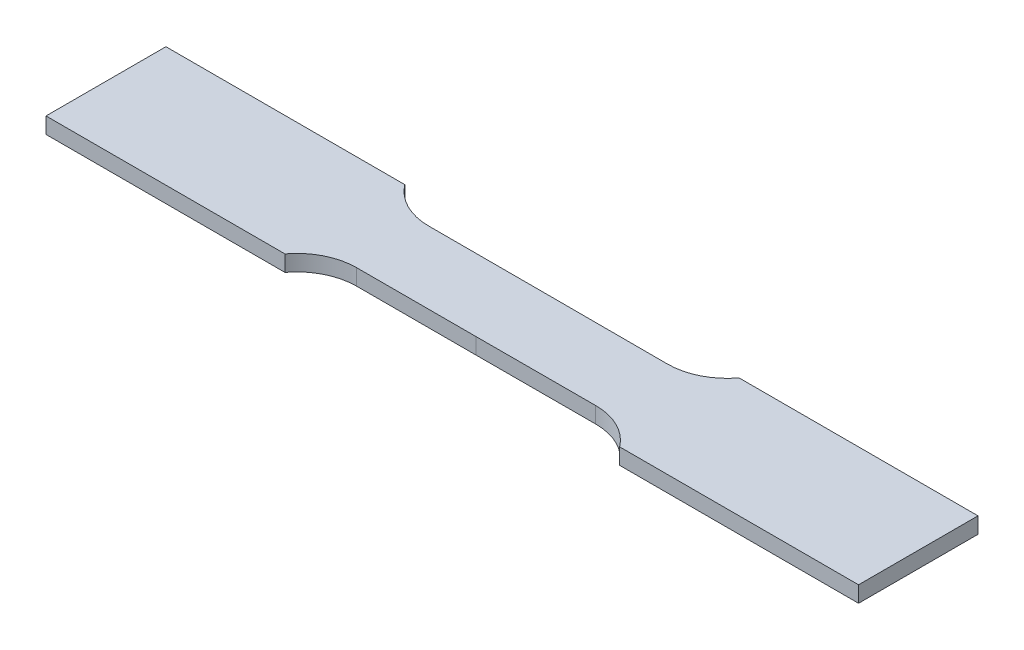
ISO-10303-21;
HEADER;
FILE_DESCRIPTION(('STEP AP214'),'2;1');
FILE_NAME('part.step','',(''),(''),'','','');
FILE_SCHEMA(('AUTOMOTIVE_DESIGN { 1 0 10303 214 1 1 1 1 }'));
ENDSEC;
DATA;
#1=APPLICATION_CONTEXT('core data for automotive mechanical design processes');
#2=APPLICATION_PROTOCOL_DEFINITION('international standard','automotive_design',2000,#1);
#3=PRODUCT_CONTEXT('',#1,'mechanical');
#4=PRODUCT('Part','Part','',(#3));
#5=PRODUCT_RELATED_PRODUCT_CATEGORY('part','',(#4));
#6=PRODUCT_DEFINITION_FORMATION('','',#4);
#7=PRODUCT_DEFINITION_CONTEXT('part definition',#1,'design');
#8=PRODUCT_DEFINITION('design','',#6,#7);
#9=PRODUCT_DEFINITION_SHAPE('','',#8);
#10=(LENGTH_UNIT() NAMED_UNIT(*) SI_UNIT(.MILLI.,.METRE.));
#11=(NAMED_UNIT(*) PLANE_ANGLE_UNIT() SI_UNIT($,.RADIAN.));
#12=(NAMED_UNIT(*) SI_UNIT($,.STERADIAN.) SOLID_ANGLE_UNIT());
#13=UNCERTAINTY_MEASURE_WITH_UNIT(LENGTH_MEASURE(1.E-05),#10,'distance_accuracy_value','');
#14=(GEOMETRIC_REPRESENTATION_CONTEXT(3) GLOBAL_UNCERTAINTY_ASSIGNED_CONTEXT((#13)) GLOBAL_UNIT_ASSIGNED_CONTEXT((#10,
#11,#12)) REPRESENTATION_CONTEXT('',''));
#15=CARTESIAN_POINT('',(0.,0.,0.));
#16=DIRECTION('',(0.,0.,1.));
#17=DIRECTION('',(1.,0.,0.));
#18=AXIS2_PLACEMENT_3D('',#15,#16,#17);
#19=CARTESIAN_POINT('',(0.,3.357,-12.4983559627253));
#20=DIRECTION('',(0.,0.,-1.));
#21=DIRECTION('',(-1.,0.,0.));
#22=AXIS2_PLACEMENT_3D('',#19,#20,#21);
#23=PLANE('',#22);
#24=DIRECTION('',(1.,0.,0.));
#25=VECTOR('',#24,1.);
#26=CARTESIAN_POINT('',(0.,0.,-12.4983559627253));
#27=LINE('',#26,#25);
#28=CARTESIAN_POINT('',(35.,0.,-12.4983559627253));
#29=VERTEX_POINT('',#28);
#30=CARTESIAN_POINT('',(85.,0.,-12.4983559627253));
#31=VERTEX_POINT('',#30);
#32=EDGE_CURVE('E167',#29,#31,#27,.T.);
#33=ORIENTED_EDGE('',*,*,#32,.F.);
#34=DIRECTION('',(0.,-1.,0.));
#35=VECTOR('',#34,1.);
#36=CARTESIAN_POINT('',(35.,3.357,-12.4983559627253));
#37=LINE('',#36,#35);
#38=CARTESIAN_POINT('',(35.,3.357,-12.4983559627253));
#39=VERTEX_POINT('',#38);
#40=EDGE_CURVE('E11',#39,#29,#37,.T.);
#41=ORIENTED_EDGE('',*,*,#40,.F.);
#42=DIRECTION('',(1.,0.,0.));
#43=VECTOR('',#42,1.);
#44=CARTESIAN_POINT('',(0.,3.357,-12.4983559627253));
#45=LINE('',#44,#43);
#46=CARTESIAN_POINT('',(85.,3.357,-12.4983559627253));
#47=VERTEX_POINT('',#46);
#48=EDGE_CURVE('E200',#39,#47,#45,.T.);
#49=ORIENTED_EDGE('',*,*,#48,.T.);
#50=DIRECTION('',(0.,-1.,0.));
#51=VECTOR('',#50,1.);
#52=CARTESIAN_POINT('',(85.,3.357,-12.4983559627253));
#53=LINE('',#52,#51);
#54=EDGE_CURVE('E52',#47,#31,#53,.T.);
#55=ORIENTED_EDGE('',*,*,#54,.T.);
#56=EDGE_LOOP('',(#33,#41,#49,#55));
#57=FACE_BOUND('',#56,.T.);
#58=ADVANCED_FACE('F36',(#57),#23,.T.);
#59=CARTESIAN_POINT('',(25.01249999375,3.357,-20.0149937500047));
#60=DIRECTION('',(0.,-1.,0.));
#61=DIRECTION('',(0.,0.,-1.));
#62=AXIS2_PLACEMENT_3D('',#59,#60,#61);
#63=CYLINDRICAL_SURFACE('',#62,12.5);
#64=CARTESIAN_POINT('',(25.01249999375,0.,-20.0149937500047));
#65=DIRECTION('',(0.,1.,0.));
#66=DIRECTION('',(0.,0.,1.));
#67=AXIS2_PLACEMENT_3D('',#64,#65,#66);
#68=CIRCLE('',#67,12.5);
#69=CARTESIAN_POINT('',(25.,0.,-7.51500000000001));
#70=VERTEX_POINT('',#69);
#71=EDGE_CURVE('E169',#29,#70,#68,.F.);
#72=ORIENTED_EDGE('',*,*,#71,.T.);
#73=DIRECTION('',(0.,-1.,0.));
#74=VECTOR('',#73,1.);
#75=CARTESIAN_POINT('',(25.,3.357,-7.51500000000001));
#76=LINE('',#75,#74);
#77=CARTESIAN_POINT('',(25.,3.357,-7.51500000000001));
#78=VERTEX_POINT('',#77);
#79=EDGE_CURVE('E44',#78,#70,#76,.T.);
#80=ORIENTED_EDGE('',*,*,#79,.F.);
#81=CARTESIAN_POINT('',(25.01249999375,3.357,-20.0149937500047));
#82=DIRECTION('',(0.,1.,0.));
#83=DIRECTION('',(0.,0.,1.));
#84=AXIS2_PLACEMENT_3D('',#81,#82,#83);
#85=CIRCLE('',#84,12.5);
#86=EDGE_CURVE('E249',#39,#78,#85,.F.);
#87=ORIENTED_EDGE('',*,*,#86,.F.);
#88=ORIENTED_EDGE('',*,*,#40,.T.);
#89=EDGE_LOOP('',(#72,#80,#87,#88));
#90=FACE_BOUND('',#89,.T.);
#91=ADVANCED_FACE('F282',(#90),#63,.F.);
#92=CARTESIAN_POINT('',(0.00753999246000593,3.357,-7.53999246000754));
#93=DIRECTION('',(-0.000999999500000161,0.,0.999999500000375));
#94=DIRECTION('',(0.999999500000375,0.,0.000999999500000161));
#95=AXIS2_PLACEMENT_3D('',#92,#93,#94);
#96=PLANE('',#95);
#97=DIRECTION('',(-0.999999500000375,0.,-0.000999999500000161));
#98=VECTOR('',#97,1.);
#99=CARTESIAN_POINT('',(0.00753999246000593,0.,-7.53999246000754));
#100=LINE('',#99,#98);
#101=CARTESIAN_POINT('',(0.,0.,-7.54));
#102=VERTEX_POINT('',#101);
#103=EDGE_CURVE('E171',#70,#102,#100,.T.);
#104=ORIENTED_EDGE('',*,*,#103,.T.);
#105=DIRECTION('',(0.,-1.,0.));
#106=VECTOR('',#105,1.);
#107=CARTESIAN_POINT('',(0.,3.357,-7.54));
#108=LINE('',#107,#106);
#109=CARTESIAN_POINT('',(0.,3.357,-7.54));
#110=VERTEX_POINT('',#109);
#111=EDGE_CURVE('E221',#110,#102,#108,.T.);
#112=ORIENTED_EDGE('',*,*,#111,.F.);
#113=DIRECTION('',(-0.999999500000375,0.,-0.000999999500000161));
#114=VECTOR('',#113,1.);
#115=CARTESIAN_POINT('',(0.00753999246000593,3.357,-7.53999246000754));
#116=LINE('',#115,#114);
#117=EDGE_CURVE('E230',#78,#110,#116,.T.);
#118=ORIENTED_EDGE('',*,*,#117,.F.);
#119=ORIENTED_EDGE('',*,*,#79,.T.);
#120=EDGE_LOOP('',(#104,#112,#118,#119));
#121=FACE_BOUND('',#120,.T.);
#122=ADVANCED_FACE('F228',(#121),#96,.F.);
#123=CARTESIAN_POINT('',(0.00150799993967863,3.357,-7.53999969840002));
#124=DIRECTION('',(-0.000199999995999818,0.,0.999999980000001));
#125=DIRECTION('',(0.999999980000001,0.,0.000199999995999818));
#126=AXIS2_PLACEMENT_3D('',#123,#124,#125);
#127=PLANE('',#126);
#128=DIRECTION('',(-0.999999980000001,0.,-0.000199999995999818));
#129=VECTOR('',#128,1.);
#130=CARTESIAN_POINT('',(0.00150799993967863,0.,-7.53999969840002));
#131=LINE('',#130,#129);
#132=CARTESIAN_POINT('',(-25.,0.,-7.545));
#133=VERTEX_POINT('',#132);
#134=EDGE_CURVE('E173',#102,#133,#131,.T.);
#135=ORIENTED_EDGE('',*,*,#134,.T.);
#136=DIRECTION('',(0.,-1.,0.));
#137=VECTOR('',#136,1.);
#138=CARTESIAN_POINT('',(-25.,3.357,-7.545));
#139=LINE('',#138,#137);
#140=CARTESIAN_POINT('',(-25.,3.357,-7.545));
#141=VERTEX_POINT('',#140);
#142=EDGE_CURVE('E219',#141,#133,#139,.T.);
#143=ORIENTED_EDGE('',*,*,#142,.F.);
#144=DIRECTION('',(-0.999999980000001,0.,-0.000199999995999818));
#145=VECTOR('',#144,1.);
#146=CARTESIAN_POINT('',(0.00150799993967863,3.357,-7.53999969840002));
#147=LINE('',#146,#145);
#148=EDGE_CURVE('E243',#110,#141,#147,.T.);
#149=ORIENTED_EDGE('',*,*,#148,.F.);
#150=ORIENTED_EDGE('',*,*,#111,.T.);
#151=EDGE_LOOP('',(#135,#143,#149,#150));
#152=FACE_BOUND('',#151,.T.);
#153=ADVANCED_FACE('F240',(#152),#127,.F.);
#154=CARTESIAN_POINT('',(-24.99750000005,3.357,-20.04499975));
#155=DIRECTION('',(0.,-1.,0.));
#156=DIRECTION('',(0.,0.,-1.));
#157=AXIS2_PLACEMENT_3D('',#154,#155,#156);
#158=CYLINDRICAL_SURFACE('',#157,12.5);
#159=CARTESIAN_POINT('',(-24.99750000005,0.,-20.04499975));
#160=DIRECTION('',(0.,1.,0.));
#161=DIRECTION('',(0.,0.,1.));
#162=AXIS2_PLACEMENT_3D('',#159,#160,#161);
#163=CIRCLE('',#162,12.5);
#164=CARTESIAN_POINT('',(-35.,0.,-12.5483342411888));
#165=VERTEX_POINT('',#164);
#166=EDGE_CURVE('E176',#165,#133,#163,.T.);
#167=ORIENTED_EDGE('',*,*,#166,.F.);
#168=DIRECTION('',(0.,-1.,0.));
#169=VECTOR('',#168,1.);
#170=CARTESIAN_POINT('',(-35.,3.357,-12.5483342411888));
#171=LINE('',#170,#169);
#172=CARTESIAN_POINT('',(-35.,3.357,-12.5483342411888));
#173=VERTEX_POINT('',#172);
#174=EDGE_CURVE('E217',#173,#165,#171,.T.);
#175=ORIENTED_EDGE('',*,*,#174,.F.);
#176=CARTESIAN_POINT('',(-24.99750000005,3.357,-20.04499975));
#177=DIRECTION('',(0.,1.,0.));
#178=DIRECTION('',(0.,0.,1.));
#179=AXIS2_PLACEMENT_3D('',#176,#177,#178);
#180=CIRCLE('',#179,12.5);
#181=EDGE_CURVE('E245',#173,#141,#180,.T.);
#182=ORIENTED_EDGE('',*,*,#181,.T.);
#183=ORIENTED_EDGE('',*,*,#142,.T.);
#184=EDGE_LOOP('',(#167,#175,#182,#183));
#185=FACE_BOUND('',#184,.T.);
#186=ADVANCED_FACE('F293',(#185),#158,.F.);
#187=CARTESIAN_POINT('',(0.,3.357,-12.5483342411888));
#188=DIRECTION('',(0.,0.,1.));
#189=DIRECTION('',(1.,0.,0.));
#190=AXIS2_PLACEMENT_3D('',#187,#188,#189);
#191=PLANE('',#190);
#192=DIRECTION('',(-1.,0.,0.));
#193=VECTOR('',#192,1.);
#194=CARTESIAN_POINT('',(0.,0.,-12.5483342411888));
#195=LINE('',#194,#193);
#196=CARTESIAN_POINT('',(-85.,0.,-12.5483342411887));
#197=VERTEX_POINT('',#196);
#198=EDGE_CURVE('E179',#165,#197,#195,.T.);
#199=ORIENTED_EDGE('',*,*,#198,.T.);
#200=DIRECTION('',(0.,-1.,0.));
#201=VECTOR('',#200,1.);
#202=CARTESIAN_POINT('',(-85.,3.357,-12.5483342411887));
#203=LINE('',#202,#201);
#204=CARTESIAN_POINT('',(-85.,3.357,-12.5483342411887));
#205=VERTEX_POINT('',#204);
#206=EDGE_CURVE('E214',#205,#197,#203,.T.);
#207=ORIENTED_EDGE('',*,*,#206,.F.);
#208=DIRECTION('',(-1.,0.,0.));
#209=VECTOR('',#208,1.);
#210=CARTESIAN_POINT('',(0.,3.357,-12.5483342411888));
#211=LINE('',#210,#209);
#212=EDGE_CURVE('E247',#173,#205,#211,.T.);
#213=ORIENTED_EDGE('',*,*,#212,.F.);
#214=ORIENTED_EDGE('',*,*,#174,.T.);
#215=EDGE_LOOP('',(#199,#207,#213,#214));
#216=FACE_BOUND('',#215,.T.);
#217=ADVANCED_FACE('F296',(#216),#191,.F.);
#218=CARTESIAN_POINT('',(-85.,3.357,0.));
#219=DIRECTION('',(1.,0.,0.));
#220=DIRECTION('',(0.,0.,-1.));
#221=AXIS2_PLACEMENT_3D('',#218,#219,#220);
#222=PLANE('',#221);
#223=DIRECTION('',(0.,0.,1.));
#224=VECTOR('',#223,1.);
#225=CARTESIAN_POINT('',(-85.,0.,0.));
#226=LINE('',#225,#224);
#227=CARTESIAN_POINT('',(-85.,0.,12.5483342411887));
#228=VERTEX_POINT('',#227);
#229=EDGE_CURVE('E181',#197,#228,#226,.T.);
#230=ORIENTED_EDGE('',*,*,#229,.T.);
#231=DIRECTION('',(0.,-1.,0.));
#232=VECTOR('',#231,1.);
#233=CARTESIAN_POINT('',(-85.,3.357,12.5483342411887));
#234=LINE('',#233,#232);
#235=CARTESIAN_POINT('',(-85.,3.357,12.5483342411887));
#236=VERTEX_POINT('',#235);
#237=EDGE_CURVE('E212',#236,#228,#234,.T.);
#238=ORIENTED_EDGE('',*,*,#237,.F.);
#239=DIRECTION('',(0.,0.,1.));
#240=VECTOR('',#239,1.);
#241=CARTESIAN_POINT('',(-85.,3.357,0.));
#242=LINE('',#241,#240);
#243=EDGE_CURVE('E254',#205,#236,#242,.T.);
#244=ORIENTED_EDGE('',*,*,#243,.F.);
#245=ORIENTED_EDGE('',*,*,#206,.T.);
#246=EDGE_LOOP('',(#230,#238,#244,#245));
#247=FACE_BOUND('',#246,.T.);
#248=ADVANCED_FACE('F300',(#247),#222,.F.);
#249=CARTESIAN_POINT('',(0.,3.357,12.5483342411888));
#250=DIRECTION('',(0.,0.,1.));
#251=DIRECTION('',(1.,0.,0.));
#252=AXIS2_PLACEMENT_3D('',#249,#250,#251);
#253=PLANE('',#252);
#254=DIRECTION('',(-1.,0.,0.));
#255=VECTOR('',#254,1.);
#256=CARTESIAN_POINT('',(0.,0.,12.5483342411888));
#257=LINE('',#256,#255);
#258=CARTESIAN_POINT('',(-35.,0.,12.5483342411888));
#259=VERTEX_POINT('',#258);
#260=EDGE_CURVE('E184',#259,#228,#257,.T.);
#261=ORIENTED_EDGE('',*,*,#260,.F.);
#262=DIRECTION('',(0.,-1.,0.));
#263=VECTOR('',#262,1.);
#264=CARTESIAN_POINT('',(-35.,3.357,12.5483342411888));
#265=LINE('',#264,#263);
#266=CARTESIAN_POINT('',(-35.,3.357,12.5483342411888));
#267=VERTEX_POINT('',#266);
#268=EDGE_CURVE('E210',#267,#259,#265,.T.);
#269=ORIENTED_EDGE('',*,*,#268,.F.);
#270=DIRECTION('',(-1.,0.,0.));
#271=VECTOR('',#270,1.);
#272=CARTESIAN_POINT('',(0.,3.357,12.5483342411888));
#273=LINE('',#272,#271);
#274=EDGE_CURVE('E256',#267,#236,#273,.T.);
#275=ORIENTED_EDGE('',*,*,#274,.T.);
#276=ORIENTED_EDGE('',*,*,#237,.T.);
#277=EDGE_LOOP('',(#261,#269,#275,#276));
#278=FACE_BOUND('',#277,.T.);
#279=ADVANCED_FACE('F304',(#278),#253,.T.);
#280=CARTESIAN_POINT('',(-24.99750000005,3.357,20.04499975));
#281=DIRECTION('',(0.,-1.,0.));
#282=DIRECTION('',(0.,0.,-1.));
#283=AXIS2_PLACEMENT_3D('',#280,#281,#282);
#284=CYLINDRICAL_SURFACE('',#283,12.5);
#285=CARTESIAN_POINT('',(-24.99750000005,0.,20.04499975));
#286=DIRECTION('',(0.,1.,0.));
#287=DIRECTION('',(0.,0.,1.));
#288=AXIS2_PLACEMENT_3D('',#285,#286,#287);
#289=CIRCLE('',#288,12.5);
#290=CARTESIAN_POINT('',(-25.,0.,7.545));
#291=VERTEX_POINT('',#290);
#292=EDGE_CURVE('E187',#259,#291,#289,.F.);
#293=ORIENTED_EDGE('',*,*,#292,.T.);
#294=DIRECTION('',(0.,-1.,0.));
#295=VECTOR('',#294,1.);
#296=CARTESIAN_POINT('',(-25.,3.357,7.545));
#297=LINE('',#296,#295);
#298=CARTESIAN_POINT('',(-25.,3.357,7.545));
#299=VERTEX_POINT('',#298);
#300=EDGE_CURVE('E207',#299,#291,#297,.T.);
#301=ORIENTED_EDGE('',*,*,#300,.F.);
#302=CARTESIAN_POINT('',(-24.99750000005,3.357,20.04499975));
#303=DIRECTION('',(0.,1.,0.));
#304=DIRECTION('',(0.,0.,1.));
#305=AXIS2_PLACEMENT_3D('',#302,#303,#304);
#306=CIRCLE('',#305,12.5);
#307=EDGE_CURVE('E259',#267,#299,#306,.F.);
#308=ORIENTED_EDGE('',*,*,#307,.F.);
#309=ORIENTED_EDGE('',*,*,#268,.T.);
#310=EDGE_LOOP('',(#293,#301,#308,#309));
#311=FACE_BOUND('',#310,.T.);
#312=ADVANCED_FACE('F308',(#311),#284,.F.);
#313=CARTESIAN_POINT('',(0.00150799993968125,3.357,7.53999969840001));
#314=DIRECTION('',(-0.000199999996000165,0.,-0.999999980000001));
#315=DIRECTION('',(-0.999999980000001,0.,0.000199999996000165));
#316=AXIS2_PLACEMENT_3D('',#313,#314,#315);
#317=PLANE('',#316);
#318=DIRECTION('',(0.999999980000001,0.,-0.000199999996000165));
#319=VECTOR('',#318,1.);
#320=CARTESIAN_POINT('',(0.00150799993968125,0.,7.53999969840001));
#321=LINE('',#320,#319);
#322=CARTESIAN_POINT('',(0.,0.,7.53999999999999));
#323=VERTEX_POINT('',#322);
#324=EDGE_CURVE('E189',#291,#323,#321,.T.);
#325=ORIENTED_EDGE('',*,*,#324,.T.);
#326=DIRECTION('',(0.,-1.,0.));
#327=VECTOR('',#326,1.);
#328=CARTESIAN_POINT('',(0.,3.357,7.53999999999999));
#329=LINE('',#328,#327);
#330=CARTESIAN_POINT('',(0.,3.357,7.53999999999999));
#331=VERTEX_POINT('',#330);
#332=EDGE_CURVE('E204',#331,#323,#329,.T.);
#333=ORIENTED_EDGE('',*,*,#332,.F.);
#334=DIRECTION('',(0.999999980000001,0.,-0.000199999996000165));
#335=VECTOR('',#334,1.);
#336=CARTESIAN_POINT('',(0.00150799993968125,3.357,7.53999969840001));
#337=LINE('',#336,#335);
#338=EDGE_CURVE('E162',#299,#331,#337,.T.);
#339=ORIENTED_EDGE('',*,*,#338,.F.);
#340=ORIENTED_EDGE('',*,*,#300,.T.);
#341=EDGE_LOOP('',(#325,#333,#339,#340));
#342=FACE_BOUND('',#341,.T.);
#343=ADVANCED_FACE('F266',(#342),#317,.F.);
#344=CARTESIAN_POINT('',(0.00753999246000906,3.357,7.53999246000753));
#345=DIRECTION('',(-0.000999999500000577,0.,-0.999999500000375));
#346=DIRECTION('',(-0.999999500000375,0.,0.000999999500000577));
#347=AXIS2_PLACEMENT_3D('',#344,#345,#346);
#348=PLANE('',#347);
#349=DIRECTION('',(0.999999500000375,0.,-0.000999999500000577));
#350=VECTOR('',#349,1.);
#351=CARTESIAN_POINT('',(0.00753999246000906,0.,7.53999246000753));
#352=LINE('',#351,#350);
#353=CARTESIAN_POINT('',(25.,0.,7.51499999999999));
#354=VERTEX_POINT('',#353);
#355=EDGE_CURVE('E191',#323,#354,#352,.T.);
#356=ORIENTED_EDGE('',*,*,#355,.T.);
#357=DIRECTION('',(0.,-1.,0.));
#358=VECTOR('',#357,1.);
#359=CARTESIAN_POINT('',(25.,3.357,7.51499999999999));
#360=LINE('',#359,#358);
#361=CARTESIAN_POINT('',(25.,3.357,7.51499999999999));
#362=VERTEX_POINT('',#361);
#363=EDGE_CURVE('E148',#362,#354,#360,.T.);
#364=ORIENTED_EDGE('',*,*,#363,.F.);
#365=DIRECTION('',(0.999999500000375,0.,-0.000999999500000577));
#366=VECTOR('',#365,1.);
#367=CARTESIAN_POINT('',(0.00753999246000906,3.357,7.53999246000753));
#368=LINE('',#367,#366);
#369=EDGE_CURVE('E159',#331,#362,#368,.T.);
#370=ORIENTED_EDGE('',*,*,#369,.F.);
#371=ORIENTED_EDGE('',*,*,#332,.T.);
#372=EDGE_LOOP('',(#356,#364,#370,#371));
#373=FACE_BOUND('',#372,.T.);
#374=ADVANCED_FACE('F270',(#373),#348,.F.);
#375=CARTESIAN_POINT('',(25.01249999375,3.357,20.0149937500047));
#376=DIRECTION('',(0.,-1.,0.));
#377=DIRECTION('',(0.,0.,-1.));
#378=AXIS2_PLACEMENT_3D('',#375,#376,#377);
#379=CYLINDRICAL_SURFACE('',#378,12.5);
#380=CARTESIAN_POINT('',(25.01249999375,0.,20.0149937500047));
#381=DIRECTION('',(0.,1.,0.));
#382=DIRECTION('',(0.,0.,1.));
#383=AXIS2_PLACEMENT_3D('',#380,#381,#382);
#384=CIRCLE('',#383,12.5);
#385=CARTESIAN_POINT('',(35.,0.,12.4983559627253));
#386=VERTEX_POINT('',#385);
#387=EDGE_CURVE('E145',#386,#354,#384,.T.);
#388=ORIENTED_EDGE('',*,*,#387,.F.);
#389=DIRECTION('',(0.,-1.,0.));
#390=VECTOR('',#389,1.);
#391=CARTESIAN_POINT('',(35.,3.357,12.4983559627253));
#392=LINE('',#391,#390);
#393=CARTESIAN_POINT('',(35.,3.357,12.4983559627253));
#394=VERTEX_POINT('',#393);
#395=EDGE_CURVE('E139',#394,#386,#392,.T.);
#396=ORIENTED_EDGE('',*,*,#395,.F.);
#397=CARTESIAN_POINT('',(25.01249999375,3.357,20.0149937500047));
#398=DIRECTION('',(0.,1.,0.));
#399=DIRECTION('',(0.,0.,1.));
#400=AXIS2_PLACEMENT_3D('',#397,#398,#399);
#401=CIRCLE('',#400,12.5);
#402=EDGE_CURVE('E143',#394,#362,#401,.T.);
#403=ORIENTED_EDGE('',*,*,#402,.T.);
#404=ORIENTED_EDGE('',*,*,#363,.T.);
#405=EDGE_LOOP('',(#388,#396,#403,#404));
#406=FACE_BOUND('',#405,.T.);
#407=ADVANCED_FACE('F141',(#406),#379,.F.);
#408=CARTESIAN_POINT('',(0.,3.357,12.4983559627253));
#409=DIRECTION('',(0.,0.,-1.));
#410=DIRECTION('',(-1.,0.,0.));
#411=AXIS2_PLACEMENT_3D('',#408,#409,#410);
#412=PLANE('',#411);
#413=DIRECTION('',(1.,0.,0.));
#414=VECTOR('',#413,1.);
#415=CARTESIAN_POINT('',(0.,0.,12.4983559627253));
#416=LINE('',#415,#414);
#417=CARTESIAN_POINT('',(85.,0.,12.4983559627253));
#418=VERTEX_POINT('',#417);
#419=EDGE_CURVE('E195',#386,#418,#416,.T.);
#420=ORIENTED_EDGE('',*,*,#419,.T.);
#421=DIRECTION('',(0.,-1.,0.));
#422=VECTOR('',#421,1.);
#423=CARTESIAN_POINT('',(85.,3.357,12.4983559627253));
#424=LINE('',#423,#422);
#425=CARTESIAN_POINT('',(85.,3.357,12.4983559627253));
#426=VERTEX_POINT('',#425);
#427=EDGE_CURVE('E96',#426,#418,#424,.T.);
#428=ORIENTED_EDGE('',*,*,#427,.F.);
#429=DIRECTION('',(1.,0.,0.));
#430=VECTOR('',#429,1.);
#431=CARTESIAN_POINT('',(0.,3.357,12.4983559627253));
#432=LINE('',#431,#430);
#433=EDGE_CURVE('E150',#394,#426,#432,.T.);
#434=ORIENTED_EDGE('',*,*,#433,.F.);
#435=ORIENTED_EDGE('',*,*,#395,.T.);
#436=EDGE_LOOP('',(#420,#428,#434,#435));
#437=FACE_BOUND('',#436,.T.);
#438=ADVANCED_FACE('F151',(#437),#412,.F.);
#439=CARTESIAN_POINT('',(85.,3.357,0.));
#440=DIRECTION('',(1.,0.,0.));
#441=DIRECTION('',(0.,0.,-1.));
#442=AXIS2_PLACEMENT_3D('',#439,#440,#441);
#443=PLANE('',#442);
#444=DIRECTION('',(0.,0.,1.));
#445=VECTOR('',#444,1.);
#446=CARTESIAN_POINT('',(85.,0.,0.));
#447=LINE('',#446,#445);
#448=EDGE_CURVE('E197',#31,#418,#447,.T.);
#449=ORIENTED_EDGE('',*,*,#448,.F.);
#450=ORIENTED_EDGE('',*,*,#54,.F.);
#451=DIRECTION('',(0.,0.,1.));
#452=VECTOR('',#451,1.);
#453=CARTESIAN_POINT('',(85.,3.357,0.));
#454=LINE('',#453,#452);
#455=EDGE_CURVE('E154',#47,#426,#454,.T.);
#456=ORIENTED_EDGE('',*,*,#455,.T.);
#457=ORIENTED_EDGE('',*,*,#427,.T.);
#458=EDGE_LOOP('',(#449,#450,#456,#457));
#459=FACE_BOUND('',#458,.T.);
#460=ADVANCED_FACE('F271',(#459),#443,.T.);
#461=CARTESIAN_POINT('',(0.,3.357,0.));
#462=DIRECTION('',(0.,1.,0.));
#463=DIRECTION('',(0.,0.,1.));
#464=AXIS2_PLACEMENT_3D('',#461,#462,#463);
#465=PLANE('',#464);
#466=ORIENTED_EDGE('',*,*,#48,.F.);
#467=ORIENTED_EDGE('',*,*,#86,.T.);
#468=ORIENTED_EDGE('',*,*,#117,.T.);
#469=ORIENTED_EDGE('',*,*,#148,.T.);
#470=ORIENTED_EDGE('',*,*,#181,.F.);
#471=ORIENTED_EDGE('',*,*,#212,.T.);
#472=ORIENTED_EDGE('',*,*,#243,.T.);
#473=ORIENTED_EDGE('',*,*,#274,.F.);
#474=ORIENTED_EDGE('',*,*,#307,.T.);
#475=ORIENTED_EDGE('',*,*,#338,.T.);
#476=ORIENTED_EDGE('',*,*,#369,.T.);
#477=ORIENTED_EDGE('',*,*,#402,.F.);
#478=ORIENTED_EDGE('',*,*,#433,.T.);
#479=ORIENTED_EDGE('',*,*,#455,.F.);
#480=EDGE_LOOP('',(#466,#467,#468,#469,#470,#471,#472,#473,#474,#475,#476,#477,#478,#479));
#481=FACE_BOUND('',#480,.T.);
#482=ADVANCED_FACE('F157',(#481),#465,.T.);
#483=CARTESIAN_POINT('',(0.,0.,0.));
#484=DIRECTION('',(0.,1.,0.));
#485=DIRECTION('',(0.,0.,1.));
#486=AXIS2_PLACEMENT_3D('',#483,#484,#485);
#487=PLANE('',#486);
#488=ORIENTED_EDGE('',*,*,#32,.T.);
#489=ORIENTED_EDGE('',*,*,#448,.T.);
#490=ORIENTED_EDGE('',*,*,#419,.F.);
#491=ORIENTED_EDGE('',*,*,#387,.T.);
#492=ORIENTED_EDGE('',*,*,#355,.F.);
#493=ORIENTED_EDGE('',*,*,#324,.F.);
#494=ORIENTED_EDGE('',*,*,#292,.F.);
#495=ORIENTED_EDGE('',*,*,#260,.T.);
#496=ORIENTED_EDGE('',*,*,#229,.F.);
#497=ORIENTED_EDGE('',*,*,#198,.F.);
#498=ORIENTED_EDGE('',*,*,#166,.T.);
#499=ORIENTED_EDGE('',*,*,#134,.F.);
#500=ORIENTED_EDGE('',*,*,#103,.F.);
#501=ORIENTED_EDGE('',*,*,#71,.F.);
#502=EDGE_LOOP('',(#488,#489,#490,#491,#492,#493,#494,#495,#496,#497,#498,#499,#500,#501));
#503=FACE_BOUND('',#502,.T.);
#504=ADVANCED_FACE('F235',(#503),#487,.F.);
#505=CLOSED_SHELL('',(#58,#91,#122,#153,#186,#217,#248,#279,#312,#343,#374,#407,#438,#460,#482,#504));
#506=MANIFOLD_SOLID_BREP('B2',#505);
#507=ADVANCED_BREP_SHAPE_REPRESENTATION('',(#18,#506),#14);
#508=SHAPE_DEFINITION_REPRESENTATION(#9,#507);
ENDSEC;
END-ISO-10303-21;
